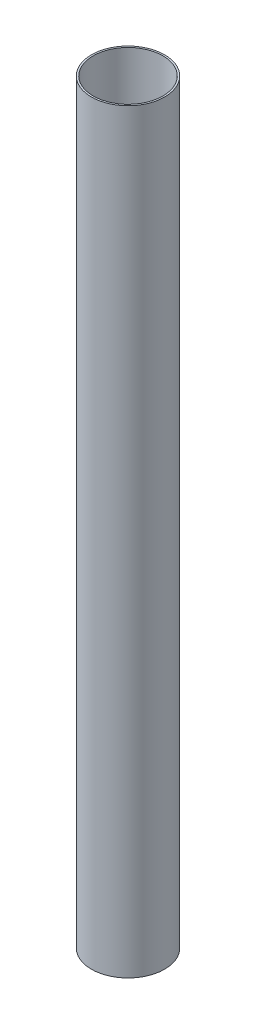
ISO-10303-21;
HEADER;
FILE_DESCRIPTION(('STEP AP214'),'2;1');
FILE_NAME('part.step','',(''),(''),'','','');
FILE_SCHEMA(('AUTOMOTIVE_DESIGN { 1 0 10303 214 1 1 1 1 }'));
ENDSEC;
DATA;
#1=APPLICATION_CONTEXT('core data for automotive mechanical design processes');
#2=APPLICATION_PROTOCOL_DEFINITION('international standard','automotive_design',2000,#1);
#3=PRODUCT_CONTEXT('',#1,'mechanical');
#4=PRODUCT('Part','Part','',(#3));
#5=PRODUCT_RELATED_PRODUCT_CATEGORY('part','',(#4));
#6=PRODUCT_DEFINITION_FORMATION('','',#4);
#7=PRODUCT_DEFINITION_CONTEXT('part definition',#1,'design');
#8=PRODUCT_DEFINITION('design','',#6,#7);
#9=PRODUCT_DEFINITION_SHAPE('','',#8);
#10=(LENGTH_UNIT() NAMED_UNIT(*) SI_UNIT(.MILLI.,.METRE.));
#11=(NAMED_UNIT(*) PLANE_ANGLE_UNIT() SI_UNIT($,.RADIAN.));
#12=(NAMED_UNIT(*) SI_UNIT($,.STERADIAN.) SOLID_ANGLE_UNIT());
#13=UNCERTAINTY_MEASURE_WITH_UNIT(LENGTH_MEASURE(1.E-05),#10,'distance_accuracy_value','');
#14=(GEOMETRIC_REPRESENTATION_CONTEXT(3) GLOBAL_UNCERTAINTY_ASSIGNED_CONTEXT((#13)) GLOBAL_UNIT_ASSIGNED_CONTEXT((#10,
#11,#12)) REPRESENTATION_CONTEXT('',''));
#15=CARTESIAN_POINT('',(0.,0.,0.));
#16=DIRECTION('',(0.,0.,1.));
#17=DIRECTION('',(1.,0.,0.));
#18=AXIS2_PLACEMENT_3D('',#15,#16,#17);
#19=CARTESIAN_POINT('',(0.,1548.892,1.22263874915645E-13));
#20=DIRECTION('',(0.,1.,0.));
#21=DIRECTION('',(-1.,0.,0.));
#22=AXIS2_PLACEMENT_3D('',#19,#20,#21);
#23=PLANE('',#22);
#24=CARTESIAN_POINT('',(0.,1548.892,1.22263874915645E-13));
#25=DIRECTION('',(0.,1.,0.));
#26=DIRECTION('',(-1.,0.,0.));
#27=AXIS2_PLACEMENT_3D('',#24,#25,#26);
#28=CIRCLE('',#27,69.5071);
#29=CARTESIAN_POINT('',(69.5071,1548.892,1.22263874915645E-13));
#30=VERTEX_POINT('',#29);
#31=EDGE_CURVE('E10',#30,#30,#28,.T.);
#32=ORIENTED_EDGE('',*,*,#31,.T.);
#33=EDGE_LOOP('',(#32));
#34=FACE_BOUND('',#33,.T.);
#35=CARTESIAN_POINT('',(0.,1548.892,1.22263874915645E-13));
#36=DIRECTION('',(0.,1.,0.));
#37=DIRECTION('',(-1.,0.,0.));
#38=AXIS2_PLACEMENT_3D('',#35,#36,#37);
#39=CIRCLE('',#38,66.1924);
#40=CARTESIAN_POINT('',(66.1924,1548.892,1.22263874915645E-13));
#41=VERTEX_POINT('',#40);
#42=EDGE_CURVE('E46',#41,#41,#39,.T.);
#43=ORIENTED_EDGE('',*,*,#42,.F.);
#44=EDGE_LOOP('',(#43));
#45=FACE_BOUND('',#44,.T.);
#46=ADVANCED_FACE('F35',(#34,#45),#23,.T.);
#47=CARTESIAN_POINT('',(0.,114.3,1.22263874915645E-13));
#48=DIRECTION('',(0.,1.,0.));
#49=DIRECTION('',(-1.,0.,0.));
#50=AXIS2_PLACEMENT_3D('',#47,#48,#49);
#51=PLANE('',#50);
#52=CARTESIAN_POINT('',(0.,114.3,1.22263874915645E-13));
#53=DIRECTION('',(0.,1.,0.));
#54=DIRECTION('',(-1.,0.,0.));
#55=AXIS2_PLACEMENT_3D('',#52,#53,#54);
#56=CIRCLE('',#55,69.5071);
#57=CARTESIAN_POINT('',(69.5071,114.3,1.22263874915645E-13));
#58=VERTEX_POINT('',#57);
#59=EDGE_CURVE('E39',#58,#58,#56,.T.);
#60=ORIENTED_EDGE('',*,*,#59,.F.);
#61=EDGE_LOOP('',(#60));
#62=FACE_BOUND('',#61,.T.);
#63=CARTESIAN_POINT('',(0.,114.3,1.22263874915645E-13));
#64=DIRECTION('',(0.,1.,0.));
#65=DIRECTION('',(-1.,0.,0.));
#66=AXIS2_PLACEMENT_3D('',#63,#64,#65);
#67=CIRCLE('',#66,66.1924);
#68=CARTESIAN_POINT('',(66.1924,114.3,1.22263874915645E-13));
#69=VERTEX_POINT('',#68);
#70=EDGE_CURVE('E48',#69,#69,#67,.T.);
#71=ORIENTED_EDGE('',*,*,#70,.T.);
#72=EDGE_LOOP('',(#71));
#73=FACE_BOUND('',#72,.T.);
#74=ADVANCED_FACE('F58',(#62,#73),#51,.F.);
#75=CARTESIAN_POINT('',(0.,1548.892,1.22263874915645E-13));
#76=DIRECTION('',(0.,-1.,0.));
#77=DIRECTION('',(1.,0.,0.));
#78=AXIS2_PLACEMENT_3D('',#75,#76,#77);
#79=CYLINDRICAL_SURFACE('',#78,69.5071);
#80=CARTESIAN_POINT('',(69.5071,1548.892,1.22263874915645E-13));
#81=CARTESIAN_POINT('',(69.5071,1533.94833333333,1.22263874915645E-13));
#82=CARTESIAN_POINT('',(69.5071,1519.00466666667,1.22263874915645E-13));
#83=CARTESIAN_POINT('',(69.5071,1489.11733333333,1.22263874915645E-13));
#84=CARTESIAN_POINT('',(69.5071,1474.17366666667,1.22263874915645E-13));
#85=CARTESIAN_POINT('',(69.5071,1444.28633333333,1.22263874915645E-13));
#86=CARTESIAN_POINT('',(69.5071,1429.34266666667,1.22263874915645E-13));
#87=CARTESIAN_POINT('',(69.5071,1399.45533333333,1.22263874915645E-13));
#88=CARTESIAN_POINT('',(69.5071,1384.51166666667,1.22263874915645E-13));
#89=CARTESIAN_POINT('',(69.5071,1354.62433333333,1.22263874915645E-13));
#90=CARTESIAN_POINT('',(69.5071,1339.68066666667,1.22263874915645E-13));
#91=CARTESIAN_POINT('',(69.5071,1309.79333333333,1.22263874915645E-13));
#92=CARTESIAN_POINT('',(69.5071,1294.84966666667,1.22263874915645E-13));
#93=CARTESIAN_POINT('',(69.5071,1264.96233333333,1.22263874915645E-13));
#94=CARTESIAN_POINT('',(69.5071,1250.01866666667,1.22263874915645E-13));
#95=CARTESIAN_POINT('',(69.5071,1220.13133333333,1.22263874915645E-13));
#96=CARTESIAN_POINT('',(69.5071,1205.18766666667,1.22263874915645E-13));
#97=CARTESIAN_POINT('',(69.5071,1175.30033333333,1.22263874915645E-13));
#98=CARTESIAN_POINT('',(69.5071,1160.35666666667,1.22263874915645E-13));
#99=CARTESIAN_POINT('',(69.5071,1130.46933333333,1.22263874915645E-13));
#100=CARTESIAN_POINT('',(69.5071,1115.52566666667,1.22263874915645E-13));
#101=CARTESIAN_POINT('',(69.5071,1085.63833333333,1.22263874915645E-13));
#102=CARTESIAN_POINT('',(69.5071,1070.69466666667,1.22263874915645E-13));
#103=CARTESIAN_POINT('',(69.5071,1040.80733333333,1.22263874915645E-13));
#104=CARTESIAN_POINT('',(69.5071,1025.86366666667,1.22263874915645E-13));
#105=CARTESIAN_POINT('',(69.5071,995.976333333333,1.22263874915645E-13));
#106=CARTESIAN_POINT('',(69.5071,981.032666666666,1.22263874915645E-13));
#107=CARTESIAN_POINT('',(69.5071,951.145333333333,1.22263874915645E-13));
#108=CARTESIAN_POINT('',(69.5071,936.201666666666,1.22263874915645E-13));
#109=CARTESIAN_POINT('',(69.5071,906.314333333333,1.22263874915645E-13));
#110=CARTESIAN_POINT('',(69.5071,891.370666666666,1.22263874915645E-13));
#111=CARTESIAN_POINT('',(69.5071,861.483333333333,1.22263874915645E-13));
#112=CARTESIAN_POINT('',(69.5071,846.539666666666,1.22263874915645E-13));
#113=CARTESIAN_POINT('',(69.5071,816.652333333333,1.22263874915645E-13));
#114=CARTESIAN_POINT('',(69.5071,801.708666666666,1.22263874915645E-13));
#115=CARTESIAN_POINT('',(69.5071,771.821333333333,1.22263874915645E-13));
#116=CARTESIAN_POINT('',(69.5071,756.877666666666,1.22263874915645E-13));
#117=CARTESIAN_POINT('',(69.5071,726.990333333333,1.22263874915645E-13));
#118=CARTESIAN_POINT('',(69.5071,712.046666666666,1.22263874915645E-13));
#119=CARTESIAN_POINT('',(69.5071,682.159333333333,1.22263874915645E-13));
#120=CARTESIAN_POINT('',(69.5071,667.215666666666,1.22263874915645E-13));
#121=CARTESIAN_POINT('',(69.5071,637.328333333333,1.22263874915645E-13));
#122=CARTESIAN_POINT('',(69.5071,622.384666666666,1.22263874915645E-13));
#123=CARTESIAN_POINT('',(69.5071,592.497333333333,1.22263874915645E-13));
#124=CARTESIAN_POINT('',(69.5071,577.553666666666,1.22263874915645E-13));
#125=CARTESIAN_POINT('',(69.5071,547.666333333333,1.22263874915645E-13));
#126=CARTESIAN_POINT('',(69.5071,532.722666666666,1.22263874915645E-13));
#127=CARTESIAN_POINT('',(69.5071,502.835333333333,1.22263874915645E-13));
#128=CARTESIAN_POINT('',(69.5071,487.891666666666,1.22263874915645E-13));
#129=CARTESIAN_POINT('',(69.5071,458.004333333333,1.22263874915645E-13));
#130=CARTESIAN_POINT('',(69.5071,443.060666666666,1.22263874915645E-13));
#131=CARTESIAN_POINT('',(69.5071,413.173333333333,1.22263874915645E-13));
#132=CARTESIAN_POINT('',(69.5071,398.229666666667,1.22263874915645E-13));
#133=CARTESIAN_POINT('',(69.5071,368.342333333333,1.22263874915645E-13));
#134=CARTESIAN_POINT('',(69.5071,353.398666666666,1.22263874915645E-13));
#135=CARTESIAN_POINT('',(69.5071,323.511333333333,1.22263874915645E-13));
#136=CARTESIAN_POINT('',(69.5071,308.567666666667,1.22263874915645E-13));
#137=CARTESIAN_POINT('',(69.5071,278.680333333333,1.22263874915645E-13));
#138=CARTESIAN_POINT('',(69.5071,263.736666666667,1.22263874915645E-13));
#139=CARTESIAN_POINT('',(69.5071,233.849333333333,1.22263874915645E-13));
#140=CARTESIAN_POINT('',(69.5071,218.905666666666,1.22263874915645E-13));
#141=CARTESIAN_POINT('',(69.5071,189.018333333333,1.22263874915645E-13));
#142=CARTESIAN_POINT('',(69.5071,174.074666666667,1.22263874915645E-13));
#143=CARTESIAN_POINT('',(69.5071,144.187333333333,1.22263874915645E-13));
#144=CARTESIAN_POINT('',(69.5071,129.243666666667,1.22263874915645E-13));
#145=CARTESIAN_POINT('',(69.5071,114.3,1.22263874915645E-13));
#146=B_SPLINE_CURVE_WITH_KNOTS('',3,(#80,#81,#82,#83,#84,#85,#86,#87,#88,#89,#90,#91,#92,#93,
#94,#95,#96,#97,#98,#99,#100,#101,#102,#103,#104,#105,#106,#107,#108,#109,#110,#111,#112,#113,
#114,#115,#116,#117,#118,#119,#120,#121,#122,#123,#124,#125,#126,#127,#128,#129,#130,#131,#132,
#133,#134,#135,#136,#137,#138,#139,#140,#141,#142,#143,#144,#145),.UNSPECIFIED.,.F.,.F.,(4,2,2,
2,2,2,2,2,2,2,2,2,2,2,2,2,2,2,2,2,2,2,2,2,2,2,2,2,2,2,2,2,4),(0.,44.8309999999998,
89.6619999999999,134.493,179.324,224.155,268.986,313.817,358.648,403.479,448.31,493.141,537.972,
582.803,627.634,672.465,717.296,762.126999999999,806.958,851.789,896.62,941.451,986.282,
1031.113,1075.944,1120.775,1165.606,1210.437,1255.268,1300.099,1344.93,1389.761,1434.592),.UNSPECIFIED.);
#147=EDGE_CURVE('BSEAM37',#30,#58,#146,.T.);
#148=ORIENTED_EDGE('',*,*,#31,.F.);
#149=ORIENTED_EDGE('',*,*,#59,.T.);
#150=ORIENTED_EDGE('',*,*,#147,.T.);
#151=ORIENTED_EDGE('',*,*,#147,.F.);
#152=EDGE_LOOP('',(#148,#150,#149,#151));
#153=FACE_BOUND('',#152,.T.);
#154=ADVANCED_FACE('F37',(#153),#79,.T.);
#155=CARTESIAN_POINT('',(0.,1548.892,1.22263874915645E-13));
#156=DIRECTION('',(0.,-1.,0.));
#157=DIRECTION('',(1.,0.,0.));
#158=AXIS2_PLACEMENT_3D('',#155,#156,#157);
#159=CYLINDRICAL_SURFACE('',#158,66.1924);
#160=CARTESIAN_POINT('',(66.1924,1548.892,1.22263874915645E-13));
#161=CARTESIAN_POINT('',(66.1924,1533.94833333333,1.22263874915645E-13));
#162=CARTESIAN_POINT('',(66.1924,1519.00466666667,1.22263874915645E-13));
#163=CARTESIAN_POINT('',(66.1924,1489.11733333333,1.22263874915645E-13));
#164=CARTESIAN_POINT('',(66.1924,1474.17366666667,1.22263874915645E-13));
#165=CARTESIAN_POINT('',(66.1924,1444.28633333333,1.22263874915645E-13));
#166=CARTESIAN_POINT('',(66.1924,1429.34266666667,1.22263874915645E-13));
#167=CARTESIAN_POINT('',(66.1924,1399.45533333333,1.22263874915645E-13));
#168=CARTESIAN_POINT('',(66.1924,1384.51166666667,1.22263874915645E-13));
#169=CARTESIAN_POINT('',(66.1924,1354.62433333333,1.22263874915645E-13));
#170=CARTESIAN_POINT('',(66.1924,1339.68066666667,1.22263874915645E-13));
#171=CARTESIAN_POINT('',(66.1924,1309.79333333333,1.22263874915645E-13));
#172=CARTESIAN_POINT('',(66.1924,1294.84966666667,1.22263874915645E-13));
#173=CARTESIAN_POINT('',(66.1924,1264.96233333333,1.22263874915645E-13));
#174=CARTESIAN_POINT('',(66.1924,1250.01866666667,1.22263874915645E-13));
#175=CARTESIAN_POINT('',(66.1924,1220.13133333333,1.22263874915645E-13));
#176=CARTESIAN_POINT('',(66.1924,1205.18766666667,1.22263874915645E-13));
#177=CARTESIAN_POINT('',(66.1924,1175.30033333333,1.22263874915645E-13));
#178=CARTESIAN_POINT('',(66.1924,1160.35666666667,1.22263874915645E-13));
#179=CARTESIAN_POINT('',(66.1924,1130.46933333333,1.22263874915645E-13));
#180=CARTESIAN_POINT('',(66.1924,1115.52566666667,1.22263874915645E-13));
#181=CARTESIAN_POINT('',(66.1924,1085.63833333333,1.22263874915645E-13));
#182=CARTESIAN_POINT('',(66.1924,1070.69466666667,1.22263874915645E-13));
#183=CARTESIAN_POINT('',(66.1924,1040.80733333333,1.22263874915645E-13));
#184=CARTESIAN_POINT('',(66.1924,1025.86366666667,1.22263874915645E-13));
#185=CARTESIAN_POINT('',(66.1924,995.976333333333,1.22263874915645E-13));
#186=CARTESIAN_POINT('',(66.1924,981.032666666666,1.22263874915645E-13));
#187=CARTESIAN_POINT('',(66.1924,951.145333333333,1.22263874915645E-13));
#188=CARTESIAN_POINT('',(66.1924,936.201666666666,1.22263874915645E-13));
#189=CARTESIAN_POINT('',(66.1924,906.314333333333,1.22263874915645E-13));
#190=CARTESIAN_POINT('',(66.1924,891.370666666666,1.22263874915645E-13));
#191=CARTESIAN_POINT('',(66.1924,861.483333333333,1.22263874915645E-13));
#192=CARTESIAN_POINT('',(66.1924,846.539666666666,1.22263874915645E-13));
#193=CARTESIAN_POINT('',(66.1924,816.652333333333,1.22263874915645E-13));
#194=CARTESIAN_POINT('',(66.1924,801.708666666666,1.22263874915645E-13));
#195=CARTESIAN_POINT('',(66.1924,771.821333333333,1.22263874915645E-13));
#196=CARTESIAN_POINT('',(66.1924,756.877666666666,1.22263874915645E-13));
#197=CARTESIAN_POINT('',(66.1924,726.990333333333,1.22263874915645E-13));
#198=CARTESIAN_POINT('',(66.1924,712.046666666666,1.22263874915645E-13));
#199=CARTESIAN_POINT('',(66.1924,682.159333333333,1.22263874915645E-13));
#200=CARTESIAN_POINT('',(66.1924,667.215666666666,1.22263874915645E-13));
#201=CARTESIAN_POINT('',(66.1924,637.328333333333,1.22263874915645E-13));
#202=CARTESIAN_POINT('',(66.1924,622.384666666666,1.22263874915645E-13));
#203=CARTESIAN_POINT('',(66.1924,592.497333333333,1.22263874915645E-13));
#204=CARTESIAN_POINT('',(66.1924,577.553666666666,1.22263874915645E-13));
#205=CARTESIAN_POINT('',(66.1924,547.666333333333,1.22263874915645E-13));
#206=CARTESIAN_POINT('',(66.1924,532.722666666666,1.22263874915645E-13));
#207=CARTESIAN_POINT('',(66.1924,502.835333333333,1.22263874915645E-13));
#208=CARTESIAN_POINT('',(66.1924,487.891666666666,1.22263874915645E-13));
#209=CARTESIAN_POINT('',(66.1924,458.004333333333,1.22263874915645E-13));
#210=CARTESIAN_POINT('',(66.1924,443.060666666666,1.22263874915645E-13));
#211=CARTESIAN_POINT('',(66.1924,413.173333333333,1.22263874915645E-13));
#212=CARTESIAN_POINT('',(66.1924,398.229666666667,1.22263874915645E-13));
#213=CARTESIAN_POINT('',(66.1924,368.342333333333,1.22263874915645E-13));
#214=CARTESIAN_POINT('',(66.1924,353.398666666666,1.22263874915645E-13));
#215=CARTESIAN_POINT('',(66.1924,323.511333333333,1.22263874915645E-13));
#216=CARTESIAN_POINT('',(66.1924,308.567666666667,1.22263874915645E-13));
#217=CARTESIAN_POINT('',(66.1924,278.680333333333,1.22263874915645E-13));
#218=CARTESIAN_POINT('',(66.1924,263.736666666667,1.22263874915645E-13));
#219=CARTESIAN_POINT('',(66.1924,233.849333333333,1.22263874915645E-13));
#220=CARTESIAN_POINT('',(66.1924,218.905666666666,1.22263874915645E-13));
#221=CARTESIAN_POINT('',(66.1924,189.018333333333,1.22263874915645E-13));
#222=CARTESIAN_POINT('',(66.1924,174.074666666667,1.22263874915645E-13));
#223=CARTESIAN_POINT('',(66.1924,144.187333333333,1.22263874915645E-13));
#224=CARTESIAN_POINT('',(66.1924,129.243666666667,1.22263874915645E-13));
#225=CARTESIAN_POINT('',(66.1924,114.3,1.22263874915645E-13));
#226=B_SPLINE_CURVE_WITH_KNOTS('',3,(#160,#161,#162,#163,#164,#165,#166,#167,#168,#169,#170,
#171,#172,#173,#174,#175,#176,#177,#178,#179,#180,#181,#182,#183,#184,#185,#186,#187,#188,#189,
#190,#191,#192,#193,#194,#195,#196,#197,#198,#199,#200,#201,#202,#203,#204,#205,#206,#207,#208,
#209,#210,#211,#212,#213,#214,#215,#216,#217,#218,#219,#220,#221,#222,#223,#224,#225),
.UNSPECIFIED.,.F.,.F.,(4,2,2,2,2,2,2,2,2,2,2,2,2,2,2,2,2,2,2,2,2,2,2,2,2,2,2,2,2,2,2,2,4),(0.,
44.8309999999998,89.6619999999999,134.493,179.324,224.155,268.986,313.817,358.648,403.479,
448.31,493.141,537.972,582.803,627.634,672.465,717.296,762.126999999999,806.958,851.789,896.62,
941.451,986.282,1031.113,1075.944,1120.775,1165.606,1210.437,1255.268,1300.099,1344.93,1389.761,
1434.592),.UNSPECIFIED.);
#227=EDGE_CURVE('BSEAM54',#41,#69,#226,.T.);
#228=ORIENTED_EDGE('',*,*,#42,.T.);
#229=ORIENTED_EDGE('',*,*,#70,.F.);
#230=ORIENTED_EDGE('',*,*,#227,.T.);
#231=ORIENTED_EDGE('',*,*,#227,.F.);
#232=EDGE_LOOP('',(#228,#230,#229,#231));
#233=FACE_BOUND('',#232,.T.);
#234=ADVANCED_FACE('F54',(#233),#159,.F.);
#235=CLOSED_SHELL('',(#46,#74,#154,#234));
#236=MANIFOLD_SOLID_BREP('B2',#235);
#237=ADVANCED_BREP_SHAPE_REPRESENTATION('',(#18,#236),#14);
#238=SHAPE_DEFINITION_REPRESENTATION(#9,#237);
ENDSEC;
END-ISO-10303-21;
